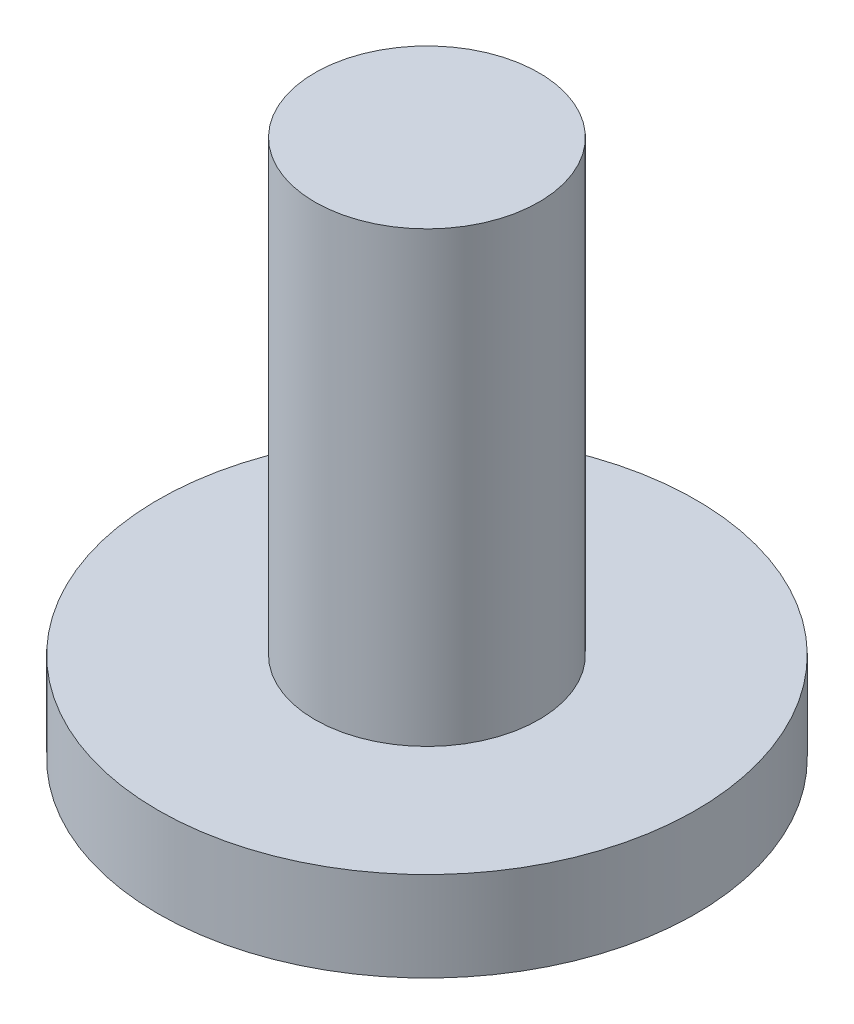
ISO-10303-21;
HEADER;
FILE_DESCRIPTION(('STEP AP214'),'2;1');
FILE_NAME('part.step','',(''),(''),'','','');
FILE_SCHEMA(('AUTOMOTIVE_DESIGN { 1 0 10303 214 1 1 1 1 }'));
ENDSEC;
DATA;
#1=APPLICATION_CONTEXT('core data for automotive mechanical design processes');
#2=APPLICATION_PROTOCOL_DEFINITION('international standard','automotive_design',2000,#1);
#3=PRODUCT_CONTEXT('',#1,'mechanical');
#4=PRODUCT('Part','Part','',(#3));
#5=PRODUCT_RELATED_PRODUCT_CATEGORY('part','',(#4));
#6=PRODUCT_DEFINITION_FORMATION('','',#4);
#7=PRODUCT_DEFINITION_CONTEXT('part definition',#1,'design');
#8=PRODUCT_DEFINITION('design','',#6,#7);
#9=PRODUCT_DEFINITION_SHAPE('','',#8);
#10=(LENGTH_UNIT() NAMED_UNIT(*) SI_UNIT(.MILLI.,.METRE.));
#11=(NAMED_UNIT(*) PLANE_ANGLE_UNIT() SI_UNIT($,.RADIAN.));
#12=(NAMED_UNIT(*) SI_UNIT($,.STERADIAN.) SOLID_ANGLE_UNIT());
#13=UNCERTAINTY_MEASURE_WITH_UNIT(LENGTH_MEASURE(1.E-05),#10,'distance_accuracy_value','');
#14=(GEOMETRIC_REPRESENTATION_CONTEXT(3) GLOBAL_UNCERTAINTY_ASSIGNED_CONTEXT((#13)) GLOBAL_UNIT_ASSIGNED_CONTEXT((#10,
#11,#12)) REPRESENTATION_CONTEXT('',''));
#15=CARTESIAN_POINT('',(0.,0.,0.));
#16=DIRECTION('',(0.,0.,1.));
#17=DIRECTION('',(1.,0.,0.));
#18=AXIS2_PLACEMENT_3D('',#15,#16,#17);
#19=CARTESIAN_POINT('',(0.,2.,0.));
#20=DIRECTION('',(0.,-1.,0.));
#21=DIRECTION('',(0.,0.,-1.));
#22=AXIS2_PLACEMENT_3D('',#19,#20,#21);
#23=CYLINDRICAL_SURFACE('',#22,6.);
#24=CARTESIAN_POINT('',(0.,2.,0.));
#25=DIRECTION('',(0.,1.,0.));
#26=DIRECTION('',(0.,0.,1.));
#27=AXIS2_PLACEMENT_3D('',#24,#25,#26);
#28=CIRCLE('',#27,6.);
#29=CARTESIAN_POINT('',(0.,2.,6.));
#30=VERTEX_POINT('',#29);
#31=EDGE_CURVE('E39',#30,#30,#28,.T.);
#32=ORIENTED_EDGE('',*,*,#31,.F.);
#33=EDGE_LOOP('',(#32));
#34=FACE_BOUND('',#33,.T.);
#35=CARTESIAN_POINT('',(0.,0.,0.));
#36=DIRECTION('',(0.,1.,0.));
#37=DIRECTION('',(0.,0.,1.));
#38=AXIS2_PLACEMENT_3D('',#35,#36,#37);
#39=CIRCLE('',#38,6.);
#40=CARTESIAN_POINT('',(0.,0.,6.));
#41=VERTEX_POINT('',#40);
#42=EDGE_CURVE('E35',#41,#41,#39,.T.);
#43=ORIENTED_EDGE('',*,*,#42,.T.);
#44=EDGE_LOOP('',(#43));
#45=FACE_BOUND('',#44,.T.);
#46=ADVANCED_FACE('F32',(#34,#45),#23,.T.);
#47=CARTESIAN_POINT('',(0.,2.,0.));
#48=DIRECTION('',(0.,1.,0.));
#49=DIRECTION('',(0.,0.,1.));
#50=AXIS2_PLACEMENT_3D('',#47,#48,#49);
#51=PLANE('',#50);
#52=CARTESIAN_POINT('',(0.,2.,0.));
#53=DIRECTION('',(0.,1.,0.));
#54=DIRECTION('',(0.,0.,1.));
#55=AXIS2_PLACEMENT_3D('',#52,#53,#54);
#56=CIRCLE('',#55,2.5);
#57=CARTESIAN_POINT('',(0.,2.,2.5));
#58=VERTEX_POINT('',#57);
#59=EDGE_CURVE('E10',#58,#58,#56,.T.);
#60=ORIENTED_EDGE('',*,*,#59,.F.);
#61=EDGE_LOOP('',(#60));
#62=FACE_BOUND('',#61,.T.);
#63=ORIENTED_EDGE('',*,*,#31,.T.);
#64=EDGE_LOOP('',(#63));
#65=FACE_BOUND('',#64,.T.);
#66=ADVANCED_FACE('F56',(#62,#65),#51,.T.);
#67=CARTESIAN_POINT('',(0.,0.,0.));
#68=DIRECTION('',(0.,1.,0.));
#69=DIRECTION('',(0.,0.,1.));
#70=AXIS2_PLACEMENT_3D('',#67,#68,#69);
#71=PLANE('',#70);
#72=ORIENTED_EDGE('',*,*,#42,.F.);
#73=EDGE_LOOP('',(#72));
#74=FACE_BOUND('',#73,.T.);
#75=ADVANCED_FACE('F53',(#74),#71,.F.);
#76=CARTESIAN_POINT('',(0.,12.,0.));
#77=DIRECTION('',(0.,-1.,0.));
#78=DIRECTION('',(0.,0.,-1.));
#79=AXIS2_PLACEMENT_3D('',#76,#77,#78);
#80=CYLINDRICAL_SURFACE('',#79,2.5);
#81=CARTESIAN_POINT('',(0.,12.,0.));
#82=DIRECTION('',(0.,1.,0.));
#83=DIRECTION('',(0.,0.,1.));
#84=AXIS2_PLACEMENT_3D('',#81,#82,#83);
#85=CIRCLE('',#84,2.5);
#86=CARTESIAN_POINT('',(0.,12.,2.5));
#87=VERTEX_POINT('',#86);
#88=EDGE_CURVE('E45',#87,#87,#85,.T.);
#89=ORIENTED_EDGE('',*,*,#88,.F.);
#90=EDGE_LOOP('',(#89));
#91=FACE_BOUND('',#90,.T.);
#92=ORIENTED_EDGE('',*,*,#59,.T.);
#93=EDGE_LOOP('',(#92));
#94=FACE_BOUND('',#93,.T.);
#95=ADVANCED_FACE('F55',(#91,#94),#80,.T.);
#96=CARTESIAN_POINT('',(0.,12.,0.));
#97=DIRECTION('',(0.,1.,0.));
#98=DIRECTION('',(0.,0.,1.));
#99=AXIS2_PLACEMENT_3D('',#96,#97,#98);
#100=PLANE('',#99);
#101=ORIENTED_EDGE('',*,*,#88,.T.);
#102=EDGE_LOOP('',(#101));
#103=FACE_BOUND('',#102,.T.);
#104=ADVANCED_FACE('F61',(#103),#100,.T.);
#105=CLOSED_SHELL('',(#46,#66,#75,#95,#104));
#106=MANIFOLD_SOLID_BREP('B2',#105);
#107=ADVANCED_BREP_SHAPE_REPRESENTATION('',(#18,#106),#14);
#108=SHAPE_DEFINITION_REPRESENTATION(#9,#107);
ENDSEC;
END-ISO-10303-21;
